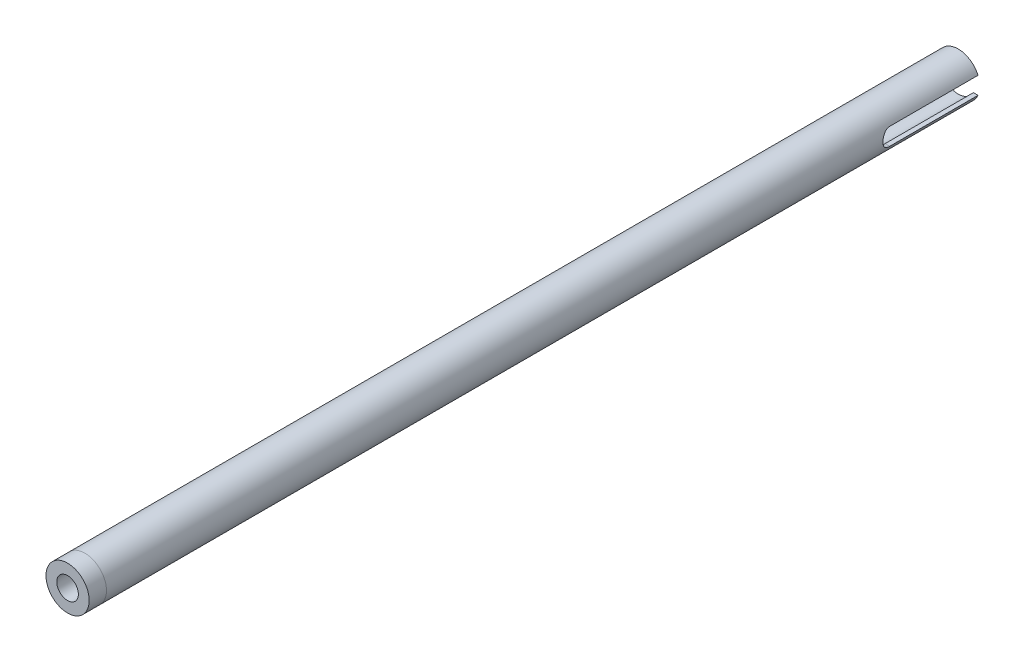
ISO-10303-21;
HEADER;
FILE_DESCRIPTION(('STEP AP214'),'2;1');
FILE_NAME('part.step','',(''),(''),'','','');
FILE_SCHEMA(('AUTOMOTIVE_DESIGN { 1 0 10303 214 1 1 1 1 }'));
ENDSEC;
DATA;
#1=APPLICATION_CONTEXT('core data for automotive mechanical design processes');
#2=APPLICATION_PROTOCOL_DEFINITION('international standard','automotive_design',2000,#1);
#3=PRODUCT_CONTEXT('',#1,'mechanical');
#4=PRODUCT('Part','Part','',(#3));
#5=PRODUCT_RELATED_PRODUCT_CATEGORY('part','',(#4));
#6=PRODUCT_DEFINITION_FORMATION('','',#4);
#7=PRODUCT_DEFINITION_CONTEXT('part definition',#1,'design');
#8=PRODUCT_DEFINITION('design','',#6,#7);
#9=PRODUCT_DEFINITION_SHAPE('','',#8);
#10=(LENGTH_UNIT() NAMED_UNIT(*) SI_UNIT(.MILLI.,.METRE.));
#11=(NAMED_UNIT(*) PLANE_ANGLE_UNIT() SI_UNIT($,.RADIAN.));
#12=(NAMED_UNIT(*) SI_UNIT($,.STERADIAN.) SOLID_ANGLE_UNIT());
#13=UNCERTAINTY_MEASURE_WITH_UNIT(LENGTH_MEASURE(1.E-05),#10,'distance_accuracy_value','');
#14=(GEOMETRIC_REPRESENTATION_CONTEXT(3) GLOBAL_UNCERTAINTY_ASSIGNED_CONTEXT((#13)) GLOBAL_UNIT_ASSIGNED_CONTEXT((#10,
#11,#12)) REPRESENTATION_CONTEXT('',''));
#15=CARTESIAN_POINT('',(0.,0.,0.));
#16=DIRECTION('',(0.,0.,1.));
#17=DIRECTION('',(1.,0.,0.));
#18=AXIS2_PLACEMENT_3D('',#15,#16,#17);
#19=CARTESIAN_POINT('',(0.,0.,-326.959127033778));
#20=DIRECTION('',(0.,0.,1.));
#21=DIRECTION('',(1.,0.,0.));
#22=AXIS2_PLACEMENT_3D('',#19,#20,#21);
#23=CYLINDRICAL_SURFACE('',#22,7.9375);
#24=CARTESIAN_POINT('',(0.,0.,-6.35));
#25=DIRECTION('',(0.,0.,1.));
#26=DIRECTION('',(1.,0.,0.));
#27=AXIS2_PLACEMENT_3D('',#24,#25,#26);
#28=CIRCLE('',#27,7.9375);
#29=CARTESIAN_POINT('',(7.9375,0.,-6.35));
#30=VERTEX_POINT('',#29);
#31=EDGE_CURVE('E175',#30,#30,#28,.T.);
#32=ORIENTED_EDGE('',*,*,#31,.F.);
#33=EDGE_LOOP('',(#32));
#34=FACE_BOUND('',#33,.T.);
#35=CARTESIAN_POINT('',(-7.2748389157424,3.175,-294.574127033778));
#36=CARTESIAN_POINT('',(-7.27482137043434,3.17501267173453,-294.488706918295));
#37=CARTESIAN_POINT('',(-7.27634297592672,3.17155313247793,-294.403296388732));
#38=CARTESIAN_POINT('',(-7.28233338484875,3.15778866907725,-294.233164384404));
#39=CARTESIAN_POINT('',(-7.28680106535325,3.14748635311323,-294.148442659545));
#40=CARTESIAN_POINT('',(-7.29852916312671,3.12019002880162,-293.980628959737));
#41=CARTESIAN_POINT('',(-7.30577831906487,3.10322299732751,-293.897531814977));
#42=CARTESIAN_POINT('',(-7.32282161153745,3.06278779397034,-293.733220712952));
#43=CARTESIAN_POINT('',(-7.33261590324725,3.03931922568674,-293.652006870839));
#44=CARTESIAN_POINT('',(-7.36535331460444,2.95952924342962,-293.412182048256));
#45=CARTESIAN_POINT('',(-7.39167595677839,2.89376893609239,-293.257057119452));
#46=CARTESIAN_POINT('',(-7.45033259991547,2.73920602658923,-292.959969692741));
#47=CARTESIAN_POINT('',(-7.48267254395243,2.65038060922872,-292.818020417523));
#48=CARTESIAN_POINT('',(-7.55175295441386,2.44684429809695,-292.543299648004));
#49=CARTESIAN_POINT('',(-7.58863404630154,2.33103943595689,-292.411372263492));
#50=CARTESIAN_POINT('',(-7.66147718953598,2.07914562663536,-292.16820937986));
#51=CARTESIAN_POINT('',(-7.69743902899202,1.94305205135848,-292.056978614932));
#52=CARTESIAN_POINT('',(-7.76611692840651,1.6477828266442,-291.854057415437));
#53=CARTESIAN_POINT('',(-7.79864638434712,1.48790317306357,-291.763323004033));
#54=CARTESIAN_POINT('',(-7.85502980346525,1.15369615984565,-291.610465450616));
#55=CARTESIAN_POINT('',(-7.87889360585224,0.979385463602728,-291.548309837998));
#56=CARTESIAN_POINT('',(-7.91022225039827,0.670405323433351,-291.467798194342));
#57=CARTESIAN_POINT('',(-7.92038443902171,0.537888188660434,-291.442120270933));
#58=CARTESIAN_POINT('',(-7.93061686811603,0.337231082382101,-291.416365187851));
#59=CARTESIAN_POINT('',(-7.93319257341971,0.269991647180293,-291.40990709057));
#60=CARTESIAN_POINT('',(-7.93663621925193,0.135173873369594,-291.401286072819));
#61=CARTESIAN_POINT('',(-7.93750363389236,0.0675954368175856,-291.399124475));
#62=CARTESIAN_POINT('',(-7.9375,0.,-291.399127033778));
#63=B_SPLINE_CURVE_WITH_KNOTS('',3,(#35,#36,#37,#38,#39,#40,#41,#42,#43,#44,#45,#46,#47,#48,#49,
#50,#51,#52,#53,#54,#55,#56,#57,#58,#59,#60,#61,#62),.UNSPECIFIED.,.F.,.F.,(4,2,2,2,2,2,2,2,2,2,
2,2,2,4),(0.,0.256160797396612,0.512224013007114,0.767261264672295,1.02231406945471,
1.53142416248594,2.04103978047897,2.57679273649398,3.11266809162683,3.6699113602974,
4.22651992730645,4.63134321412667,4.8339937586662,5.03670667834028),.UNSPECIFIED.);
#64=CARTESIAN_POINT('',(-7.2748389157424,3.175,-294.574127033778));
#65=VERTEX_POINT('',#64);
#66=CARTESIAN_POINT('',(-7.9375,0.,-291.399127033778));
#67=VERTEX_POINT('',#66);
#68=EDGE_CURVE('E209',#65,#67,#63,.T.);
#69=ORIENTED_EDGE('',*,*,#68,.T.);
#70=CARTESIAN_POINT('',(-7.9375,0.,-291.399127033778));
#71=CARTESIAN_POINT('',(-7.93751279435796,-0.0856973243893202,-291.399115003608));
#72=CARTESIAN_POINT('',(-7.93611246860092,-0.171386675169295,-291.402596371081));
#73=CARTESIAN_POINT('',(-7.93058107051394,-0.342092796869091,-291.416452466415));
#74=CARTESIAN_POINT('',(-7.92645080745519,-0.427109759557719,-291.426825151398));
#75=CARTESIAN_POINT('',(-7.91557399086504,-0.595570690948314,-291.454322345466));
#76=CARTESIAN_POINT('',(-7.90883664469869,-0.679019123580001,-291.471423096739));
#77=CARTESIAN_POINT('',(-7.89293284658536,-0.844038966454637,-291.512190344212));
#78=CARTESIAN_POINT('',(-7.88376629739099,-0.925610301410299,-291.535857103269));
#79=CARTESIAN_POINT('',(-7.8529700783248,-1.16656173687588,-291.616364758967));
#80=CARTESIAN_POINT('',(-7.82802544143957,-1.3224472028299,-291.682757391845));
#81=CARTESIAN_POINT('',(-7.77174407779742,-1.62081902572889,-291.838802795838));
#82=CARTESIAN_POINT('',(-7.74040257287306,-1.76329524966531,-291.928472967901));
#83=CARTESIAN_POINT('',(-7.67287736621953,-2.03755465224644,-292.132926575416));
#84=CARTESIAN_POINT('',(-7.63654472176442,-2.16862853615059,-292.248613432147));
#85=CARTESIAN_POINT('',(-7.56380976030912,-2.4101102261282,-292.499907533857));
#86=CARTESIAN_POINT('',(-7.52740741976911,-2.52050895891189,-292.635523478339));
#87=CARTESIAN_POINT('',(-7.45683282624283,-2.72240939900243,-292.930221973205));
#88=CARTESIAN_POINT('',(-7.4228346735038,-2.81283701743191,-293.090085963121));
#89=CARTESIAN_POINT('',(-7.36333622196319,-2.96511894168389,-293.424211927917));
#90=CARTESIAN_POINT('',(-7.33782422493328,-3.02701262758154,-293.598453665676));
#91=CARTESIAN_POINT('',(-7.30424985403508,-3.10695047193342,-293.906757390327));
#92=CARTESIAN_POINT('',(-7.29331360019113,-3.13238569878909,-294.038616151213));
#93=CARTESIAN_POINT('',(-7.28227977674291,-3.15790858319,-294.238333032907));
#94=CARTESIAN_POINT('',(-7.27949685702346,-3.16431127275806,-294.305281323667));
#95=CARTESIAN_POINT('',(-7.27577355567174,-3.17285909036155,-294.439522881533));
#96=CARTESIAN_POINT('',(-7.27483380475762,-3.1750027609968,-294.506816258831));
#97=CARTESIAN_POINT('',(-7.2748389157424,-3.175,-294.574127033778));
#98=B_SPLINE_CURVE_WITH_KNOTS('',3,(#70,#71,#72,#73,#74,#75,#76,#77,#78,#79,#80,#81,#82,#83,#84,
#85,#86,#87,#88,#89,#90,#91,#92,#93,#94,#95,#96,#97),.UNSPECIFIED.,.F.,.F.,(4,2,2,2,2,2,2,2,2,2,
2,2,2,4),(0.,0.256996432008012,0.513916713336978,0.769937797705373,1.02596913282157,
1.53722547809955,2.04886511530059,2.58219314099272,3.11575467201799,3.67332953074268,
4.2301325519037,4.63306130520176,4.8348500382744,5.03670780985613),.UNSPECIFIED.);
#99=CARTESIAN_POINT('',(-7.2748389157424,-3.175,-294.574127033778));
#100=VERTEX_POINT('',#99);
#101=EDGE_CURVE('E151',#67,#100,#98,.T.);
#102=ORIENTED_EDGE('',*,*,#101,.T.);
#103=DIRECTION('',(0.,0.,-1.));
#104=VECTOR('',#103,1.);
#105=CARTESIAN_POINT('',(-7.2748389157424,-3.175,-291.399127033778));
#106=LINE('',#105,#104);
#107=CARTESIAN_POINT('',(-7.2748389157424,-3.175,-326.959127033778));
#108=VERTEX_POINT('',#107);
#109=EDGE_CURVE('E146',#100,#108,#106,.T.);
#110=ORIENTED_EDGE('',*,*,#109,.T.);
#111=CARTESIAN_POINT('',(0.,0.,-326.959127033778));
#112=DIRECTION('',(0.,0.,1.));
#113=DIRECTION('',(1.,0.,0.));
#114=AXIS2_PLACEMENT_3D('',#111,#112,#113);
#115=CIRCLE('',#114,7.9375);
#116=CARTESIAN_POINT('',(7.2748389157424,-3.175,-326.959127033778));
#117=VERTEX_POINT('',#116);
#118=EDGE_CURVE('E149',#108,#117,#115,.T.);
#119=ORIENTED_EDGE('',*,*,#118,.T.);
#120=DIRECTION('',(0.,0.,-1.));
#121=VECTOR('',#120,1.);
#122=CARTESIAN_POINT('',(7.2748389157424,-3.175,-291.399127033778));
#123=LINE('',#122,#121);
#124=CARTESIAN_POINT('',(7.2748389157424,-3.175,-294.574127033778));
#125=VERTEX_POINT('',#124);
#126=EDGE_CURVE('E459',#125,#117,#123,.T.);
#127=ORIENTED_EDGE('',*,*,#126,.F.);
#128=CARTESIAN_POINT('',(7.2748389157424,-3.175,-294.574127033778));
#129=CARTESIAN_POINT('',(7.27482137043434,-3.17501267173453,-294.488706918295));
#130=CARTESIAN_POINT('',(7.27634297592672,-3.17155313247793,-294.403296388732));
#131=CARTESIAN_POINT('',(7.28233338484875,-3.15778866907725,-294.233164384404));
#132=CARTESIAN_POINT('',(7.28680106535325,-3.14748635311323,-294.148442659545));
#133=CARTESIAN_POINT('',(7.29852916312671,-3.12019002880162,-293.980628959737));
#134=CARTESIAN_POINT('',(7.30577831906487,-3.10322299732751,-293.897531814977));
#135=CARTESIAN_POINT('',(7.32282161153745,-3.06278779397034,-293.733220712952));
#136=CARTESIAN_POINT('',(7.33261590324725,-3.03931922568674,-293.652006870839));
#137=CARTESIAN_POINT('',(7.36535331460444,-2.95952924342962,-293.412182048256));
#138=CARTESIAN_POINT('',(7.39167595677839,-2.89376893609239,-293.257057119452));
#139=CARTESIAN_POINT('',(7.45033259991547,-2.73920602658923,-292.959969692741));
#140=CARTESIAN_POINT('',(7.48267254395243,-2.65038060922872,-292.818020417523));
#141=CARTESIAN_POINT('',(7.55175295441386,-2.44684429809695,-292.543299648004));
#142=CARTESIAN_POINT('',(7.58863404630154,-2.33103943595689,-292.411372263492));
#143=CARTESIAN_POINT('',(7.66147718953598,-2.07914562663536,-292.16820937986));
#144=CARTESIAN_POINT('',(7.69743902899202,-1.94305205135848,-292.056978614932));
#145=CARTESIAN_POINT('',(7.76611692840651,-1.6477828266442,-291.854057415437));
#146=CARTESIAN_POINT('',(7.79864638434712,-1.48790317306357,-291.763323004033));
#147=CARTESIAN_POINT('',(7.85502980346525,-1.15369615984565,-291.610465450616));
#148=CARTESIAN_POINT('',(7.87889360585224,-0.979385463602728,-291.548309837998));
#149=CARTESIAN_POINT('',(7.91022225039827,-0.670405323433351,-291.467798194342));
#150=CARTESIAN_POINT('',(7.92038443902171,-0.537888188660434,-291.442120270933));
#151=CARTESIAN_POINT('',(7.93061686811603,-0.337231082382101,-291.416365187851));
#152=CARTESIAN_POINT('',(7.93319257341971,-0.269991647180293,-291.40990709057));
#153=CARTESIAN_POINT('',(7.93663621925193,-0.135173873369594,-291.401286072819));
#154=CARTESIAN_POINT('',(7.93750363389236,-0.0675954368175856,-291.399124475));
#155=CARTESIAN_POINT('',(7.9375,0.,-291.399127033778));
#156=B_SPLINE_CURVE_WITH_KNOTS('',3,(#128,#129,#130,#131,#132,#133,#134,#135,#136,#137,#138,
#139,#140,#141,#142,#143,#144,#145,#146,#147,#148,#149,#150,#151,#152,#153,#154,#155),
.UNSPECIFIED.,.F.,.F.,(4,2,2,2,2,2,2,2,2,2,2,2,2,4),(0.,0.256160797396612,0.512224013007114,
0.767261264672295,1.02231406945471,1.53142416248594,2.04103978047897,2.57679273649398,
3.11266809162683,3.6699113602974,4.22651992730645,4.63134321412667,4.8339937586662,
5.03670667834028),.UNSPECIFIED.);
#157=CARTESIAN_POINT('',(7.9375,0.,-291.399127033778));
#158=VERTEX_POINT('',#157);
#159=EDGE_CURVE('E92',#125,#158,#156,.T.);
#160=ORIENTED_EDGE('',*,*,#159,.T.);
#161=CARTESIAN_POINT('',(7.9375,0.,-291.399127033778));
#162=CARTESIAN_POINT('',(7.93751279435796,0.0856973243893202,-291.399115003608));
#163=CARTESIAN_POINT('',(7.93611246860092,0.171386675169295,-291.402596371081));
#164=CARTESIAN_POINT('',(7.93058107051394,0.342092796869091,-291.416452466415));
#165=CARTESIAN_POINT('',(7.92645080745519,0.427109759557719,-291.426825151398));
#166=CARTESIAN_POINT('',(7.91557399086504,0.595570690948314,-291.454322345466));
#167=CARTESIAN_POINT('',(7.90883664469869,0.679019123580001,-291.471423096739));
#168=CARTESIAN_POINT('',(7.89293284658536,0.844038966454637,-291.512190344212));
#169=CARTESIAN_POINT('',(7.88376629739099,0.925610301410299,-291.535857103269));
#170=CARTESIAN_POINT('',(7.8529700783248,1.16656173687588,-291.616364758967));
#171=CARTESIAN_POINT('',(7.82802544143957,1.3224472028299,-291.682757391845));
#172=CARTESIAN_POINT('',(7.77174407779742,1.62081902572889,-291.838802795838));
#173=CARTESIAN_POINT('',(7.74040257287306,1.76329524966531,-291.928472967901));
#174=CARTESIAN_POINT('',(7.67287736621953,2.03755465224644,-292.132926575416));
#175=CARTESIAN_POINT('',(7.63654472176442,2.16862853615059,-292.248613432147));
#176=CARTESIAN_POINT('',(7.56380976030912,2.4101102261282,-292.499907533857));
#177=CARTESIAN_POINT('',(7.52740741976911,2.52050895891189,-292.635523478339));
#178=CARTESIAN_POINT('',(7.45683282624283,2.72240939900243,-292.930221973205));
#179=CARTESIAN_POINT('',(7.4228346735038,2.81283701743191,-293.090085963121));
#180=CARTESIAN_POINT('',(7.36333622196319,2.96511894168389,-293.424211927917));
#181=CARTESIAN_POINT('',(7.33782422493328,3.02701262758154,-293.598453665676));
#182=CARTESIAN_POINT('',(7.30424985403508,3.10695047193342,-293.906757390327));
#183=CARTESIAN_POINT('',(7.29331360019113,3.13238569878909,-294.038616151213));
#184=CARTESIAN_POINT('',(7.28227977674291,3.15790858319,-294.238333032907));
#185=CARTESIAN_POINT('',(7.27949685702346,3.16431127275806,-294.305281323667));
#186=CARTESIAN_POINT('',(7.27577355567174,3.17285909036155,-294.439522881533));
#187=CARTESIAN_POINT('',(7.27483380475762,3.1750027609968,-294.506816258831));
#188=CARTESIAN_POINT('',(7.2748389157424,3.175,-294.574127033778));
#189=B_SPLINE_CURVE_WITH_KNOTS('',3,(#161,#162,#163,#164,#165,#166,#167,#168,#169,#170,#171,
#172,#173,#174,#175,#176,#177,#178,#179,#180,#181,#182,#183,#184,#185,#186,#187,#188),
.UNSPECIFIED.,.F.,.F.,(4,2,2,2,2,2,2,2,2,2,2,2,2,4),(0.,0.256996432008012,0.513916713336978,
0.769937797705373,1.02596913282157,1.53722547809955,2.04886511530059,2.58219314099272,
3.11575467201799,3.67332953074268,4.2301325519037,4.63306130520176,4.8348500382744,
5.03670780985613),.UNSPECIFIED.);
#190=CARTESIAN_POINT('',(7.2748389157424,3.175,-294.574127033778));
#191=VERTEX_POINT('',#190);
#192=EDGE_CURVE('E78',#158,#191,#189,.T.);
#193=ORIENTED_EDGE('',*,*,#192,.T.);
#194=DIRECTION('',(0.,0.,-1.));
#195=VECTOR('',#194,1.);
#196=CARTESIAN_POINT('',(7.2748389157424,3.175,-291.399127033778));
#197=LINE('',#196,#195);
#198=CARTESIAN_POINT('',(7.2748389157424,3.175,-326.959127033778));
#199=VERTEX_POINT('',#198);
#200=EDGE_CURVE('E167',#191,#199,#197,.T.);
#201=ORIENTED_EDGE('',*,*,#200,.T.);
#202=CARTESIAN_POINT('',(-7.2748389157424,3.175,-326.959127033778));
#203=VERTEX_POINT('',#202);
#204=EDGE_CURVE('E174',#199,#203,#115,.T.);
#205=ORIENTED_EDGE('',*,*,#204,.T.);
#206=DIRECTION('',(0.,0.,-1.));
#207=VECTOR('',#206,1.);
#208=CARTESIAN_POINT('',(-7.2748389157424,3.175,-291.399127033778));
#209=LINE('',#208,#207);
#210=EDGE_CURVE('E448',#65,#203,#209,.T.);
#211=ORIENTED_EDGE('',*,*,#210,.F.);
#212=EDGE_LOOP('',(#69,#102,#110,#119,#127,#160,#193,#201,#205,#211));
#213=FACE_BOUND('',#212,.T.);
#214=ADVANCED_FACE('F67',(#34,#213),#23,.T.);
#215=CARTESIAN_POINT('',(0.,0.,-326.959127033778));
#216=DIRECTION('',(0.,0.,1.));
#217=DIRECTION('',(1.,0.,0.));
#218=AXIS2_PLACEMENT_3D('',#215,#216,#217);
#219=PLANE('',#218);
#220=DIRECTION('',(1.,0.,0.));
#221=VECTOR('',#220,1.);
#222=CARTESIAN_POINT('',(0.,-3.175,-326.959127033778));
#223=LINE('',#222,#221);
#224=CARTESIAN_POINT('',(-5.57246419907746,-3.175,-326.959127033778));
#225=VERTEX_POINT('',#224);
#226=EDGE_CURVE('E159',#108,#225,#223,.T.);
#227=ORIENTED_EDGE('',*,*,#226,.T.);
#228=CARTESIAN_POINT('',(0.,0.,-326.959127033778));
#229=DIRECTION('',(0.,0.,1.));
#230=DIRECTION('',(1.,0.,0.));
#231=AXIS2_PLACEMENT_3D('',#228,#229,#230);
#232=CIRCLE('',#231,6.4135);
#233=CARTESIAN_POINT('',(5.57246419907746,-3.175,-326.959127033778));
#234=VERTEX_POINT('',#233);
#235=EDGE_CURVE('E300',#225,#234,#232,.T.);
#236=ORIENTED_EDGE('',*,*,#235,.T.);
#237=DIRECTION('',(1.,0.,0.));
#238=VECTOR('',#237,1.);
#239=CARTESIAN_POINT('',(0.,-3.175,-326.959127033778));
#240=LINE('',#239,#238);
#241=EDGE_CURVE('E172',#234,#117,#240,.T.);
#242=ORIENTED_EDGE('',*,*,#241,.T.);
#243=ORIENTED_EDGE('',*,*,#118,.F.);
#244=EDGE_LOOP('',(#227,#236,#242,#243));
#245=FACE_BOUND('',#244,.T.);
#246=ADVANCED_FACE('F170',(#245),#219,.F.);
#247=CARTESIAN_POINT('',(0.,0.,-326.959127033778));
#248=DIRECTION('',(0.,0.,1.));
#249=DIRECTION('',(1.,0.,0.));
#250=AXIS2_PLACEMENT_3D('',#247,#248,#249);
#251=CYLINDRICAL_SURFACE('',#250,6.4135);
#252=CARTESIAN_POINT('',(0.,0.,-6.35));
#253=DIRECTION('',(0.,0.,1.));
#254=DIRECTION('',(1.,0.,0.));
#255=AXIS2_PLACEMENT_3D('',#252,#253,#254);
#256=CIRCLE('',#255,6.4135);
#257=CARTESIAN_POINT('',(6.4135,0.,-6.35));
#258=VERTEX_POINT('',#257);
#259=EDGE_CURVE('E155',#258,#258,#256,.T.);
#260=ORIENTED_EDGE('',*,*,#259,.T.);
#261=EDGE_LOOP('',(#260));
#262=FACE_BOUND('',#261,.T.);
#263=DIRECTION('',(0.,0.,-1.));
#264=VECTOR('',#263,1.);
#265=CARTESIAN_POINT('',(-5.57246419907746,-3.175,-291.399127033778));
#266=LINE('',#265,#264);
#267=CARTESIAN_POINT('',(-5.57246419907746,-3.175,-294.574127033778));
#268=VERTEX_POINT('',#267);
#269=EDGE_CURVE('E156',#268,#225,#266,.T.);
#270=ORIENTED_EDGE('',*,*,#269,.F.);
#271=CARTESIAN_POINT('',(-5.57246419907746,-3.175,-294.574127033778));
#272=CARTESIAN_POINT('',(-5.57244013006406,-3.17501485930532,-294.490847920739));
#273=CARTESIAN_POINT('',(-5.57433046393327,-3.17172393593588,-294.407582153869));
#274=CARTESIAN_POINT('',(-5.58175879139227,-3.1586474174694,-294.241774569057));
#275=CARTESIAN_POINT('',(-5.58729459414878,-3.14886572313218,-294.159232346456));
#276=CARTESIAN_POINT('',(-5.60179156831921,-3.12299843383606,-293.995935539726));
#277=CARTESIAN_POINT('',(-5.61073298145,-3.10694918790096,-293.915173434813));
#278=CARTESIAN_POINT('',(-5.63171276239417,-3.06875665913499,-293.755529519312));
#279=CARTESIAN_POINT('',(-5.64375147558632,-3.04661269666535,-293.676647919492));
#280=CARTESIAN_POINT('',(-5.6838799338154,-2.97148657354665,-293.443914744493));
#281=CARTESIAN_POINT('',(-5.71602843451585,-2.9097324304215,-293.293494247254));
#282=CARTESIAN_POINT('',(-5.78746445334562,-2.76491119647659,-293.005037030426));
#283=CARTESIAN_POINT('',(-5.82676307252431,-2.68181088046088,-292.86702007306));
#284=CARTESIAN_POINT('',(-5.91189137020974,-2.48887418737119,-292.595222989032));
#285=CARTESIAN_POINT('',(-5.95799203211626,-2.37743022169017,-292.462666186581));
#286=CARTESIAN_POINT('',(-6.04933625068998,-2.1343317962695,-292.217198517508));
#287=CARTESIAN_POINT('',(-6.09457954365871,-2.00267122837298,-292.104293610495));
#288=CARTESIAN_POINT('',(-6.18270630442022,-1.71220053093684,-291.893974318043));
#289=CARTESIAN_POINT('',(-6.22523407848511,-1.55216870534977,-291.798084567612));
#290=CARTESIAN_POINT('',(-6.29953728626817,-1.21586879246633,-291.635235671295));
#291=CARTESIAN_POINT('',(-6.33132906884324,-1.03962591706377,-291.568232493252));
#292=CARTESIAN_POINT('',(-6.37455801221378,-0.719418942476251,-291.478360660921));
#293=CARTESIAN_POINT('',(-6.38903678436651,-0.577736145507957,-291.448787946557));
#294=CARTESIAN_POINT('',(-6.40364692368403,-0.362616983152035,-291.419066872242));
#295=CARTESIAN_POINT('',(-6.40733246196224,-0.290370591494077,-291.411599359605));
#296=CARTESIAN_POINT('',(-6.41226237468065,-0.145424356491906,-291.401626470667));
#297=CARTESIAN_POINT('',(-6.41350576158006,-0.072724341630371,-291.399123101729));
#298=CARTESIAN_POINT('',(-6.4135,0.,-291.399127033778));
#299=B_SPLINE_CURVE_WITH_KNOTS('',3,(#271,#272,#273,#274,#275,#276,#277,#278,#279,#280,#281,
#282,#283,#284,#285,#286,#287,#288,#289,#290,#291,#292,#293,#294,#295,#296,#297,#298),
.UNSPECIFIED.,.F.,.F.,(4,2,2,2,2,2,2,2,2,2,2,2,2,4),(0.,0.249729002226553,0.499308060527526,
0.747460667546715,0.995640957972498,1.49055300136661,1.98624009021394,2.52160227908796,
3.05712653941521,3.62817923327589,4.19835836008502,4.63305000595099,4.85103401853339,
5.06910615989469),.UNSPECIFIED.);
#300=CARTESIAN_POINT('',(-6.4135,0.,-291.399127033778));
#301=VERTEX_POINT('',#300);
#302=EDGE_CURVE('E236',#268,#301,#299,.T.);
#303=ORIENTED_EDGE('',*,*,#302,.T.);
#304=CARTESIAN_POINT('',(-6.4135,0.,-291.399127033778));
#305=CARTESIAN_POINT('',(-6.41351478956106,0.0839162873638173,-291.399113633881));
#306=CARTESIAN_POINT('',(-6.41185341043851,0.167823114288178,-291.402453559929));
#307=CARTESIAN_POINT('',(-6.40528923860734,0.334952536326365,-291.415736000533));
#308=CARTESIAN_POINT('',(-6.40038773102953,0.41817538948009,-291.425675897354));
#309=CARTESIAN_POINT('',(-6.38748331817869,0.582965498785221,-291.451994701872));
#310=CARTESIAN_POINT('',(-6.37949454331383,0.664538541389254,-291.46834427736));
#311=CARTESIAN_POINT('',(-6.36062930478242,0.82582159525237,-291.507282580954));
#312=CARTESIAN_POINT('',(-6.34975266552956,0.905531492908813,-291.529871688435));
#313=CARTESIAN_POINT('',(-6.31319792977547,1.14087800407252,-291.606608251194));
#314=CARTESIAN_POINT('',(-6.28356695572383,1.29306927815055,-291.669779899383));
#315=CARTESIAN_POINT('',(-6.21648032622801,1.58455945770354,-291.817930641362));
#316=CARTESIAN_POINT('',(-6.17901685649498,1.72384528592309,-291.902931533142));
#317=CARTESIAN_POINT('',(-6.09713913910647,1.99475482128857,-292.098031671393));
#318=CARTESIAN_POINT('',(-6.05244508581476,2.12544046453043,-292.209316548132));
#319=CARTESIAN_POINT('',(-5.96206469267669,2.36716277188881,-292.451285994297));
#320=CARTESIAN_POINT('',(-5.9163776032387,2.47818397002904,-292.581985686136));
#321=CARTESIAN_POINT('',(-5.82517699615972,2.68591268931947,-292.871031515088));
#322=CARTESIAN_POINT('',(-5.77994318763785,2.78087960507693,-293.030726709669));
#323=CARTESIAN_POINT('',(-5.69959190124919,2.94207442790849,-293.36610998685));
#324=CARTESIAN_POINT('',(-5.66445328320705,3.00836254036259,-293.541763620022));
#325=CARTESIAN_POINT('',(-5.61637168534322,3.09697219420916,-293.860214994416));
#326=CARTESIAN_POINT('',(-5.60011055849822,3.12606223436071,-294.000629597075));
#327=CARTESIAN_POINT('',(-5.58363385282995,3.15533369889113,-294.214006475318));
#328=CARTESIAN_POINT('',(-5.57946041232981,3.16269716900746,-294.2857382002));
#329=CARTESIAN_POINT('',(-5.57386984218861,3.17253394278506,-294.429680140242));
#330=CARTESIAN_POINT('',(-5.57245416126573,3.17500467618403,-294.501890586914));
#331=CARTESIAN_POINT('',(-5.57246419907746,3.175,-294.574127033778));
#332=B_SPLINE_CURVE_WITH_KNOTS('',3,(#304,#305,#306,#307,#308,#309,#310,#311,#312,#313,#314,
#315,#316,#317,#318,#319,#320,#321,#322,#323,#324,#325,#326,#327,#328,#329,#330,#331),
.UNSPECIFIED.,.F.,.F.,(4,2,2,2,2,2,2,2,2,2,2,2,2,4),(0.,0.251650249697321,0.503200747298848,
0.753613280993143,1.00404104361821,1.50387930503277,2.00421864304452,2.53410176460236,
3.06439980342595,3.63519589642623,4.20478783377489,4.63602373673199,4.85251353275909,
5.06911702550462),.UNSPECIFIED.);
#333=CARTESIAN_POINT('',(-5.57246419907746,3.175,-294.574127033778));
#334=VERTEX_POINT('',#333);
#335=EDGE_CURVE('E200',#301,#334,#332,.T.);
#336=ORIENTED_EDGE('',*,*,#335,.T.);
#337=DIRECTION('',(0.,0.,-1.));
#338=VECTOR('',#337,1.);
#339=CARTESIAN_POINT('',(-5.57246419907746,3.175,-291.399127033778));
#340=LINE('',#339,#338);
#341=CARTESIAN_POINT('',(-5.57246419907746,3.175,-326.959127033778));
#342=VERTEX_POINT('',#341);
#343=EDGE_CURVE('E444',#334,#342,#340,.T.);
#344=ORIENTED_EDGE('',*,*,#343,.T.);
#345=CARTESIAN_POINT('',(5.57246419907746,3.175,-326.959127033778));
#346=VERTEX_POINT('',#345);
#347=EDGE_CURVE('E182',#346,#342,#232,.T.);
#348=ORIENTED_EDGE('',*,*,#347,.F.);
#349=DIRECTION('',(0.,0.,-1.));
#350=VECTOR('',#349,1.);
#351=CARTESIAN_POINT('',(5.57246419907746,3.175,-291.399127033778));
#352=LINE('',#351,#350);
#353=CARTESIAN_POINT('',(5.57246419907746,3.175,-294.574127033778));
#354=VERTEX_POINT('',#353);
#355=EDGE_CURVE('E292',#354,#346,#352,.T.);
#356=ORIENTED_EDGE('',*,*,#355,.F.);
#357=CARTESIAN_POINT('',(5.57246419907746,3.175,-294.574127033778));
#358=CARTESIAN_POINT('',(5.57244013006406,3.17501485930532,-294.490847920739));
#359=CARTESIAN_POINT('',(5.57433046393327,3.17172393593588,-294.407582153869));
#360=CARTESIAN_POINT('',(5.58175879139227,3.1586474174694,-294.241774569057));
#361=CARTESIAN_POINT('',(5.58729459414878,3.14886572313218,-294.159232346456));
#362=CARTESIAN_POINT('',(5.60179156831921,3.12299843383606,-293.995935539726));
#363=CARTESIAN_POINT('',(5.61073298145,3.10694918790096,-293.915173434813));
#364=CARTESIAN_POINT('',(5.63171276239417,3.06875665913499,-293.755529519312));
#365=CARTESIAN_POINT('',(5.64375147558632,3.04661269666535,-293.676647919492));
#366=CARTESIAN_POINT('',(5.6838799338154,2.97148657354665,-293.443914744493));
#367=CARTESIAN_POINT('',(5.71602843451585,2.9097324304215,-293.293494247254));
#368=CARTESIAN_POINT('',(5.78746445334562,2.76491119647659,-293.005037030426));
#369=CARTESIAN_POINT('',(5.82676307252431,2.68181088046088,-292.86702007306));
#370=CARTESIAN_POINT('',(5.91189137020974,2.48887418737119,-292.595222989032));
#371=CARTESIAN_POINT('',(5.95799203211626,2.37743022169017,-292.462666186581));
#372=CARTESIAN_POINT('',(6.04933625068998,2.1343317962695,-292.217198517508));
#373=CARTESIAN_POINT('',(6.09457954365871,2.00267122837298,-292.104293610495));
#374=CARTESIAN_POINT('',(6.18270630442022,1.71220053093684,-291.893974318043));
#375=CARTESIAN_POINT('',(6.22523407848511,1.55216870534977,-291.798084567612));
#376=CARTESIAN_POINT('',(6.29953728626817,1.21586879246633,-291.635235671295));
#377=CARTESIAN_POINT('',(6.33132906884324,1.03962591706377,-291.568232493252));
#378=CARTESIAN_POINT('',(6.37455801221378,0.719418942476251,-291.478360660921));
#379=CARTESIAN_POINT('',(6.38903678436651,0.577736145507957,-291.448787946557));
#380=CARTESIAN_POINT('',(6.40364692368403,0.362616983152035,-291.419066872242));
#381=CARTESIAN_POINT('',(6.40733246196224,0.290370591494077,-291.411599359605));
#382=CARTESIAN_POINT('',(6.41226237468065,0.145424356491906,-291.401626470667));
#383=CARTESIAN_POINT('',(6.41350576158006,0.072724341630371,-291.399123101729));
#384=CARTESIAN_POINT('',(6.4135,0.,-291.399127033778));
#385=B_SPLINE_CURVE_WITH_KNOTS('',3,(#357,#358,#359,#360,#361,#362,#363,#364,#365,#366,#367,
#368,#369,#370,#371,#372,#373,#374,#375,#376,#377,#378,#379,#380,#381,#382,#383,#384),
.UNSPECIFIED.,.F.,.F.,(4,2,2,2,2,2,2,2,2,2,2,2,2,4),(0.,0.249729002226553,0.499308060527526,
0.747460667546715,0.995640957972498,1.49055300136661,1.98624009021394,2.52160227908796,
3.05712653941521,3.62817923327589,4.19835836008502,4.63305000595099,4.85103401853339,
5.06910615989469),.UNSPECIFIED.);
#386=CARTESIAN_POINT('',(6.4135,0.,-291.399127033778));
#387=VERTEX_POINT('',#386);
#388=EDGE_CURVE('E13',#354,#387,#385,.T.);
#389=ORIENTED_EDGE('',*,*,#388,.T.);
#390=CARTESIAN_POINT('',(6.4135,0.,-291.399127033778));
#391=CARTESIAN_POINT('',(6.41351478956106,-0.0839162873638173,-291.399113633881));
#392=CARTESIAN_POINT('',(6.41185341043851,-0.167823114288178,-291.402453559929));
#393=CARTESIAN_POINT('',(6.40528923860734,-0.334952536326365,-291.415736000533));
#394=CARTESIAN_POINT('',(6.40038773102953,-0.41817538948009,-291.425675897354));
#395=CARTESIAN_POINT('',(6.38748331817869,-0.582965498785221,-291.451994701872));
#396=CARTESIAN_POINT('',(6.37949454331383,-0.664538541389254,-291.46834427736));
#397=CARTESIAN_POINT('',(6.36062930478242,-0.82582159525237,-291.507282580954));
#398=CARTESIAN_POINT('',(6.34975266552956,-0.905531492908813,-291.529871688435));
#399=CARTESIAN_POINT('',(6.31319792977547,-1.14087800407252,-291.606608251194));
#400=CARTESIAN_POINT('',(6.28356695572383,-1.29306927815055,-291.669779899383));
#401=CARTESIAN_POINT('',(6.21648032622801,-1.58455945770354,-291.817930641362));
#402=CARTESIAN_POINT('',(6.17901685649498,-1.72384528592309,-291.902931533142));
#403=CARTESIAN_POINT('',(6.09713913910647,-1.99475482128857,-292.098031671393));
#404=CARTESIAN_POINT('',(6.05244508581476,-2.12544046453043,-292.209316548132));
#405=CARTESIAN_POINT('',(5.96206469267669,-2.36716277188881,-292.451285994297));
#406=CARTESIAN_POINT('',(5.9163776032387,-2.47818397002904,-292.581985686136));
#407=CARTESIAN_POINT('',(5.82517699615972,-2.68591268931947,-292.871031515088));
#408=CARTESIAN_POINT('',(5.77994318763785,-2.78087960507693,-293.030726709669));
#409=CARTESIAN_POINT('',(5.69959190124919,-2.94207442790849,-293.36610998685));
#410=CARTESIAN_POINT('',(5.66445328320705,-3.00836254036259,-293.541763620022));
#411=CARTESIAN_POINT('',(5.61637168534322,-3.09697219420916,-293.860214994416));
#412=CARTESIAN_POINT('',(5.60011055849822,-3.12606223436071,-294.000629597075));
#413=CARTESIAN_POINT('',(5.58363385282995,-3.15533369889113,-294.214006475318));
#414=CARTESIAN_POINT('',(5.57946041232981,-3.16269716900746,-294.2857382002));
#415=CARTESIAN_POINT('',(5.57386984218861,-3.17253394278506,-294.429680140242));
#416=CARTESIAN_POINT('',(5.57245416126573,-3.17500467618403,-294.501890586914));
#417=CARTESIAN_POINT('',(5.57246419907746,-3.175,-294.574127033778));
#418=B_SPLINE_CURVE_WITH_KNOTS('',3,(#390,#391,#392,#393,#394,#395,#396,#397,#398,#399,#400,
#401,#402,#403,#404,#405,#406,#407,#408,#409,#410,#411,#412,#413,#414,#415,#416,#417),
.UNSPECIFIED.,.F.,.F.,(4,2,2,2,2,2,2,2,2,2,2,2,2,4),(0.,0.251650249697321,0.503200747298848,
0.753613280993143,1.00404104361821,1.50387930503277,2.00421864304452,2.53410176460236,
3.06439980342595,3.63519589642623,4.20478783377489,4.63602373673199,4.85251353275909,
5.06911702550462),.UNSPECIFIED.);
#419=CARTESIAN_POINT('',(5.57246419907746,-3.175,-294.574127033778));
#420=VERTEX_POINT('',#419);
#421=EDGE_CURVE('E254',#387,#420,#418,.T.);
#422=ORIENTED_EDGE('',*,*,#421,.T.);
#423=DIRECTION('',(0.,0.,-1.));
#424=VECTOR('',#423,1.);
#425=CARTESIAN_POINT('',(5.57246419907746,-3.175,-291.399127033778));
#426=LINE('',#425,#424);
#427=EDGE_CURVE('E295',#420,#234,#426,.T.);
#428=ORIENTED_EDGE('',*,*,#427,.T.);
#429=ORIENTED_EDGE('',*,*,#235,.F.);
#430=EDGE_LOOP('',(#270,#303,#336,#344,#348,#356,#389,#422,#428,#429));
#431=FACE_BOUND('',#430,.T.);
#432=ADVANCED_FACE('F216',(#262,#431),#251,.F.);
#433=ORIENTED_EDGE('',*,*,#347,.T.);
#434=DIRECTION('',(1.,0.,0.));
#435=VECTOR('',#434,1.);
#436=CARTESIAN_POINT('',(0.,3.175,-326.959127033778));
#437=LINE('',#436,#435);
#438=EDGE_CURVE('E166',#203,#342,#437,.T.);
#439=ORIENTED_EDGE('',*,*,#438,.F.);
#440=ORIENTED_EDGE('',*,*,#204,.F.);
#441=DIRECTION('',(1.,0.,0.));
#442=VECTOR('',#441,1.);
#443=CARTESIAN_POINT('',(0.,3.175,-326.959127033778));
#444=LINE('',#443,#442);
#445=EDGE_CURVE('E273',#346,#199,#444,.T.);
#446=ORIENTED_EDGE('',*,*,#445,.F.);
#447=EDGE_LOOP('',(#433,#439,#440,#446));
#448=FACE_BOUND('',#447,.T.);
#449=ADVANCED_FACE('F313',(#448),#219,.F.);
#450=CARTESIAN_POINT('',(0.,0.,-6.35));
#451=DIRECTION('',(0.,0.,1.));
#452=DIRECTION('',(1.,0.,0.));
#453=AXIS2_PLACEMENT_3D('',#450,#451,#452);
#454=PLANE('',#453);
#455=ORIENTED_EDGE('',*,*,#259,.F.);
#456=EDGE_LOOP('',(#455));
#457=FACE_BOUND('',#456,.T.);
#458=ORIENTED_EDGE('',*,*,#31,.T.);
#459=EDGE_LOOP('',(#458));
#460=FACE_BOUND('',#459,.T.);
#461=ADVANCED_FACE('F310',(#457,#460),#454,.T.);
#462=CARTESIAN_POINT('',(0.,3.175,-291.399127033778));
#463=DIRECTION('',(0.,1.,0.));
#464=DIRECTION('',(0.,0.,1.));
#465=AXIS2_PLACEMENT_3D('',#462,#463,#464);
#466=PLANE('',#465);
#467=ORIENTED_EDGE('',*,*,#200,.F.);
#468=DIRECTION('',(1.,0.,0.));
#469=VECTOR('',#468,1.);
#470=CARTESIAN_POINT('',(5.57246419907746,3.175,-294.574127033778));
#471=LINE('',#470,#469);
#472=EDGE_CURVE('E197',#191,#354,#471,.F.);
#473=ORIENTED_EDGE('',*,*,#472,.T.);
#474=ORIENTED_EDGE('',*,*,#355,.T.);
#475=ORIENTED_EDGE('',*,*,#445,.T.);
#476=EDGE_LOOP('',(#467,#473,#474,#475));
#477=FACE_BOUND('',#476,.T.);
#478=ADVANCED_FACE('F288',(#477),#466,.F.);
#479=CARTESIAN_POINT('',(0.,-3.175,-291.399127033778));
#480=DIRECTION('',(0.,1.,0.));
#481=DIRECTION('',(0.,0.,1.));
#482=AXIS2_PLACEMENT_3D('',#479,#480,#481);
#483=PLANE('',#482);
#484=ORIENTED_EDGE('',*,*,#427,.F.);
#485=DIRECTION('',(1.,0.,0.));
#486=VECTOR('',#485,1.);
#487=CARTESIAN_POINT('',(0.,-3.175,-294.574127033778));
#488=LINE('',#487,#486);
#489=EDGE_CURVE('E193',#420,#125,#488,.T.);
#490=ORIENTED_EDGE('',*,*,#489,.T.);
#491=ORIENTED_EDGE('',*,*,#126,.T.);
#492=ORIENTED_EDGE('',*,*,#241,.F.);
#493=EDGE_LOOP('',(#484,#490,#491,#492));
#494=FACE_BOUND('',#493,.T.);
#495=ADVANCED_FACE('F388',(#494),#483,.T.);
#496=CARTESIAN_POINT('',(0.,-3.175,-291.399127033778));
#497=DIRECTION('',(0.,1.,0.));
#498=DIRECTION('',(0.,0.,1.));
#499=AXIS2_PLACEMENT_3D('',#496,#497,#498);
#500=PLANE('',#499);
#501=ORIENTED_EDGE('',*,*,#109,.F.);
#502=DIRECTION('',(1.,0.,0.));
#503=VECTOR('',#502,1.);
#504=CARTESIAN_POINT('',(0.,-3.175,-294.574127033778));
#505=LINE('',#504,#503);
#506=EDGE_CURVE('E190',#100,#268,#505,.T.);
#507=ORIENTED_EDGE('',*,*,#506,.T.);
#508=ORIENTED_EDGE('',*,*,#269,.T.);
#509=ORIENTED_EDGE('',*,*,#226,.F.);
#510=EDGE_LOOP('',(#501,#507,#508,#509));
#511=FACE_BOUND('',#510,.T.);
#512=ADVANCED_FACE('F160',(#511),#500,.T.);
#513=CARTESIAN_POINT('',(0.,3.175,-291.399127033778));
#514=DIRECTION('',(0.,1.,0.));
#515=DIRECTION('',(0.,0.,1.));
#516=AXIS2_PLACEMENT_3D('',#513,#514,#515);
#517=PLANE('',#516);
#518=ORIENTED_EDGE('',*,*,#343,.F.);
#519=DIRECTION('',(1.,0.,0.));
#520=VECTOR('',#519,1.);
#521=CARTESIAN_POINT('',(-7.2748389157424,3.175,-294.574127033778));
#522=LINE('',#521,#520);
#523=EDGE_CURVE('E180',#334,#65,#522,.F.);
#524=ORIENTED_EDGE('',*,*,#523,.T.);
#525=ORIENTED_EDGE('',*,*,#210,.T.);
#526=ORIENTED_EDGE('',*,*,#438,.T.);
#527=EDGE_LOOP('',(#518,#524,#525,#526));
#528=FACE_BOUND('',#527,.T.);
#529=ADVANCED_FACE('F231',(#528),#517,.F.);
#530=CARTESIAN_POINT('',(0.,0.,-294.574127033778));
#531=DIRECTION('',(1.,0.,0.));
#532=DIRECTION('',(0.,0.,-1.));
#533=AXIS2_PLACEMENT_3D('',#530,#531,#532);
#534=CYLINDRICAL_SURFACE('',#533,3.175);
#535=ORIENTED_EDGE('',*,*,#506,.F.);
#536=ORIENTED_EDGE('',*,*,#101,.F.);
#537=DIRECTION('',(1.,0.,0.));
#538=VECTOR('',#537,1.);
#539=CARTESIAN_POINT('',(0.,0.,-291.399127033778));
#540=LINE('',#539,#538);
#541=EDGE_CURVE('E270',#301,#67,#540,.F.);
#542=ORIENTED_EDGE('',*,*,#541,.F.);
#543=ORIENTED_EDGE('',*,*,#302,.F.);
#544=EDGE_LOOP('',(#535,#536,#542,#543));
#545=FACE_BOUND('',#544,.T.);
#546=ADVANCED_FACE('F224',(#545),#534,.F.);
#547=CARTESIAN_POINT('',(0.,0.,-294.574127033778));
#548=DIRECTION('',(-1.,0.,0.));
#549=DIRECTION('',(0.,0.,1.));
#550=AXIS2_PLACEMENT_3D('',#547,#548,#549);
#551=CYLINDRICAL_SURFACE('',#550,3.175);
#552=ORIENTED_EDGE('',*,*,#68,.F.);
#553=ORIENTED_EDGE('',*,*,#523,.F.);
#554=ORIENTED_EDGE('',*,*,#335,.F.);
#555=ORIENTED_EDGE('',*,*,#541,.T.);
#556=EDGE_LOOP('',(#552,#553,#554,#555));
#557=FACE_BOUND('',#556,.T.);
#558=ADVANCED_FACE('F220',(#557),#551,.F.);
#559=CARTESIAN_POINT('',(0.,0.,-294.574127033778));
#560=DIRECTION('',(-1.,0.,0.));
#561=DIRECTION('',(0.,0.,1.));
#562=AXIS2_PLACEMENT_3D('',#559,#560,#561);
#563=CYLINDRICAL_SURFACE('',#562,3.175);
#564=DIRECTION('',(1.,0.,0.));
#565=VECTOR('',#564,1.);
#566=CARTESIAN_POINT('',(7.2748389157424,0.,-291.399127033778));
#567=LINE('',#566,#565);
#568=EDGE_CURVE('E72',#387,#158,#567,.T.);
#569=ORIENTED_EDGE('',*,*,#568,.F.);
#570=ORIENTED_EDGE('',*,*,#388,.F.);
#571=ORIENTED_EDGE('',*,*,#472,.F.);
#572=ORIENTED_EDGE('',*,*,#192,.F.);
#573=EDGE_LOOP('',(#569,#570,#571,#572));
#574=FACE_BOUND('',#573,.T.);
#575=ADVANCED_FACE('F69',(#574),#563,.F.);
#576=CARTESIAN_POINT('',(0.,0.,-294.574127033778));
#577=DIRECTION('',(1.,0.,0.));
#578=DIRECTION('',(0.,0.,-1.));
#579=AXIS2_PLACEMENT_3D('',#576,#577,#578);
#580=CYLINDRICAL_SURFACE('',#579,3.175);
#581=ORIENTED_EDGE('',*,*,#421,.F.);
#582=ORIENTED_EDGE('',*,*,#568,.T.);
#583=ORIENTED_EDGE('',*,*,#159,.F.);
#584=ORIENTED_EDGE('',*,*,#489,.F.);
#585=EDGE_LOOP('',(#581,#582,#583,#584));
#586=FACE_BOUND('',#585,.T.);
#587=ADVANCED_FACE('F233',(#586),#580,.F.);
#588=CLOSED_SHELL('',(#214,#246,#432,#449,#461,#478,#495,#512,#529,#546,#558,#575,#587));
#589=MANIFOLD_SOLID_BREP('B2',#588);
#590=CARTESIAN_POINT('',(0.,0.,-6.35));
#591=DIRECTION('',(0.,0.,1.));
#592=DIRECTION('',(1.,0.,0.));
#593=AXIS2_PLACEMENT_3D('',#590,#591,#592);
#594=CYLINDRICAL_SURFACE('',#593,7.9375);
#595=CARTESIAN_POINT('',(0.,0.,-6.35));
#596=DIRECTION('',(0.,0.,1.));
#597=DIRECTION('',(1.,0.,0.));
#598=AXIS2_PLACEMENT_3D('',#595,#596,#597);
#599=CIRCLE('',#598,7.9375);
#600=CARTESIAN_POINT('',(7.9375,0.,-6.35));
#601=VERTEX_POINT('',#600);
#602=EDGE_CURVE('E66',#601,#601,#599,.T.);
#603=ORIENTED_EDGE('',*,*,#602,.T.);
#604=EDGE_LOOP('',(#603));
#605=FACE_BOUND('',#604,.T.);
#606=CARTESIAN_POINT('',(0.,0.,0.));
#607=DIRECTION('',(0.,0.,1.));
#608=DIRECTION('',(1.,0.,0.));
#609=AXIS2_PLACEMENT_3D('',#606,#607,#608);
#610=CIRCLE('',#609,7.9375);
#611=CARTESIAN_POINT('',(7.9375,0.,0.));
#612=VERTEX_POINT('',#611);
#613=EDGE_CURVE('E501',#612,#612,#610,.T.);
#614=ORIENTED_EDGE('',*,*,#613,.F.);
#615=EDGE_LOOP('',(#614));
#616=FACE_BOUND('',#615,.T.);
#617=ADVANCED_FACE('F490',(#605,#616),#594,.T.);
#618=CARTESIAN_POINT('',(0.,0.,-6.35));
#619=DIRECTION('',(0.,0.,1.));
#620=DIRECTION('',(1.,0.,0.));
#621=AXIS2_PLACEMENT_3D('',#618,#619,#620);
#622=CYLINDRICAL_SURFACE('',#621,3.96875);
#623=CARTESIAN_POINT('',(0.,0.,0.));
#624=DIRECTION('',(0.,0.,1.));
#625=DIRECTION('',(1.,0.,0.));
#626=AXIS2_PLACEMENT_3D('',#623,#624,#625);
#627=CIRCLE('',#626,3.96875);
#628=CARTESIAN_POINT('',(3.96875,0.,0.));
#629=VERTEX_POINT('',#628);
#630=EDGE_CURVE('E493',#629,#629,#627,.T.);
#631=ORIENTED_EDGE('',*,*,#630,.T.);
#632=EDGE_LOOP('',(#631));
#633=FACE_BOUND('',#632,.T.);
#634=CARTESIAN_POINT('',(0.,0.,-15.875));
#635=DIRECTION('',(0.,0.,1.));
#636=DIRECTION('',(1.,0.,0.));
#637=AXIS2_PLACEMENT_3D('',#634,#635,#636);
#638=CIRCLE('',#637,3.96875);
#639=CARTESIAN_POINT('',(3.96875,0.,-15.875));
#640=VERTEX_POINT('',#639);
#641=EDGE_CURVE('E513',#640,#640,#638,.T.);
#642=ORIENTED_EDGE('',*,*,#641,.F.);
#643=EDGE_LOOP('',(#642));
#644=FACE_BOUND('',#643,.T.);
#645=ADVANCED_FACE('F521',(#633,#644),#622,.F.);
#646=CARTESIAN_POINT('',(0.,0.,-6.35));
#647=DIRECTION('',(0.,0.,1.));
#648=DIRECTION('',(1.,0.,0.));
#649=AXIS2_PLACEMENT_3D('',#646,#647,#648);
#650=PLANE('',#649);
#651=CARTESIAN_POINT('',(0.,0.,-6.35));
#652=DIRECTION('',(0.,0.,1.));
#653=DIRECTION('',(1.,0.,0.));
#654=AXIS2_PLACEMENT_3D('',#651,#652,#653);
#655=CIRCLE('',#654,6.4135);
#656=CARTESIAN_POINT('',(6.4135,0.,-6.35));
#657=VERTEX_POINT('',#656);
#658=EDGE_CURVE('E503',#657,#657,#655,.T.);
#659=ORIENTED_EDGE('',*,*,#658,.T.);
#660=EDGE_LOOP('',(#659));
#661=FACE_BOUND('',#660,.T.);
#662=ORIENTED_EDGE('',*,*,#602,.F.);
#663=EDGE_LOOP('',(#662));
#664=FACE_BOUND('',#663,.T.);
#665=ADVANCED_FACE('F523',(#661,#664),#650,.F.);
#666=CARTESIAN_POINT('',(0.,0.,0.));
#667=DIRECTION('',(0.,0.,1.));
#668=DIRECTION('',(1.,0.,0.));
#669=AXIS2_PLACEMENT_3D('',#666,#667,#668);
#670=PLANE('',#669);
#671=ORIENTED_EDGE('',*,*,#613,.T.);
#672=EDGE_LOOP('',(#671));
#673=FACE_BOUND('',#672,.T.);
#674=ORIENTED_EDGE('',*,*,#630,.F.);
#675=EDGE_LOOP('',(#674));
#676=FACE_BOUND('',#675,.T.);
#677=ADVANCED_FACE('F529',(#673,#676),#670,.T.);
#678=CARTESIAN_POINT('',(0.,0.,-15.875));
#679=DIRECTION('',(0.,0.,1.));
#680=DIRECTION('',(1.,0.,0.));
#681=AXIS2_PLACEMENT_3D('',#678,#679,#680);
#682=CYLINDRICAL_SURFACE('',#681,6.4135);
#683=CARTESIAN_POINT('',(0.,0.,-15.875));
#684=DIRECTION('',(0.,0.,1.));
#685=DIRECTION('',(1.,0.,0.));
#686=AXIS2_PLACEMENT_3D('',#683,#684,#685);
#687=CIRCLE('',#686,6.4135);
#688=CARTESIAN_POINT('',(6.4135,0.,-15.875));
#689=VERTEX_POINT('',#688);
#690=EDGE_CURVE('E506',#689,#689,#687,.T.);
#691=CARTESIAN_POINT('',(6.4135,0.,-15.875));
#692=CARTESIAN_POINT('',(6.4135,0.,-15.77578125));
#693=CARTESIAN_POINT('',(6.4135,0.,-15.6765625));
#694=CARTESIAN_POINT('',(6.4135,0.,-15.478125));
#695=CARTESIAN_POINT('',(6.4135,0.,-15.37890625));
#696=CARTESIAN_POINT('',(6.4135,0.,-15.18046875));
#697=CARTESIAN_POINT('',(6.4135,0.,-15.08125));
#698=CARTESIAN_POINT('',(6.4135,0.,-14.8828125));
#699=CARTESIAN_POINT('',(6.4135,0.,-14.78359375));
#700=CARTESIAN_POINT('',(6.4135,0.,-14.58515625));
#701=CARTESIAN_POINT('',(6.4135,0.,-14.4859375));
#702=CARTESIAN_POINT('',(6.4135,0.,-14.2875));
#703=CARTESIAN_POINT('',(6.4135,0.,-14.18828125));
#704=CARTESIAN_POINT('',(6.4135,0.,-13.98984375));
#705=CARTESIAN_POINT('',(6.4135,0.,-13.890625));
#706=CARTESIAN_POINT('',(6.4135,0.,-13.6921875));
#707=CARTESIAN_POINT('',(6.4135,0.,-13.59296875));
#708=CARTESIAN_POINT('',(6.4135,0.,-13.39453125));
#709=CARTESIAN_POINT('',(6.4135,0.,-13.2953125));
#710=CARTESIAN_POINT('',(6.4135,0.,-13.096875));
#711=CARTESIAN_POINT('',(6.4135,0.,-12.99765625));
#712=CARTESIAN_POINT('',(6.4135,0.,-12.79921875));
#713=CARTESIAN_POINT('',(6.4135,0.,-12.7));
#714=CARTESIAN_POINT('',(6.4135,0.,-12.5015625));
#715=CARTESIAN_POINT('',(6.4135,0.,-12.40234375));
#716=CARTESIAN_POINT('',(6.4135,0.,-12.20390625));
#717=CARTESIAN_POINT('',(6.4135,0.,-12.1046875));
#718=CARTESIAN_POINT('',(6.4135,0.,-11.90625));
#719=CARTESIAN_POINT('',(6.4135,0.,-11.80703125));
#720=CARTESIAN_POINT('',(6.4135,0.,-11.60859375));
#721=CARTESIAN_POINT('',(6.4135,0.,-11.509375));
#722=CARTESIAN_POINT('',(6.4135,0.,-11.3109375));
#723=CARTESIAN_POINT('',(6.4135,0.,-11.21171875));
#724=CARTESIAN_POINT('',(6.4135,0.,-11.01328125));
#725=CARTESIAN_POINT('',(6.4135,0.,-10.9140625));
#726=CARTESIAN_POINT('',(6.4135,0.,-10.715625));
#727=CARTESIAN_POINT('',(6.4135,0.,-10.61640625));
#728=CARTESIAN_POINT('',(6.4135,0.,-10.41796875));
#729=CARTESIAN_POINT('',(6.4135,0.,-10.31875));
#730=CARTESIAN_POINT('',(6.4135,0.,-10.1203125));
#731=CARTESIAN_POINT('',(6.4135,0.,-10.02109375));
#732=CARTESIAN_POINT('',(6.4135,0.,-9.82265625));
#733=CARTESIAN_POINT('',(6.4135,0.,-9.7234375));
#734=CARTESIAN_POINT('',(6.4135,0.,-9.525));
#735=CARTESIAN_POINT('',(6.4135,0.,-9.42578125));
#736=CARTESIAN_POINT('',(6.4135,0.,-9.22734375));
#737=CARTESIAN_POINT('',(6.4135,0.,-9.128125));
#738=CARTESIAN_POINT('',(6.4135,0.,-8.9296875));
#739=CARTESIAN_POINT('',(6.4135,0.,-8.83046875));
#740=CARTESIAN_POINT('',(6.4135,0.,-8.63203125));
#741=CARTESIAN_POINT('',(6.4135,0.,-8.5328125));
#742=CARTESIAN_POINT('',(6.4135,0.,-8.334375));
#743=CARTESIAN_POINT('',(6.4135,0.,-8.23515625));
#744=CARTESIAN_POINT('',(6.4135,0.,-8.03671875));
#745=CARTESIAN_POINT('',(6.4135,0.,-7.9375));
#746=CARTESIAN_POINT('',(6.4135,0.,-7.7390625));
#747=CARTESIAN_POINT('',(6.4135,0.,-7.63984375));
#748=CARTESIAN_POINT('',(6.4135,0.,-7.44140625));
#749=CARTESIAN_POINT('',(6.4135,0.,-7.3421875));
#750=CARTESIAN_POINT('',(6.4135,0.,-7.14375));
#751=CARTESIAN_POINT('',(6.4135,0.,-7.04453125));
#752=CARTESIAN_POINT('',(6.4135,0.,-6.84609375));
#753=CARTESIAN_POINT('',(6.4135,0.,-6.746875));
#754=CARTESIAN_POINT('',(6.4135,0.,-6.5484375));
#755=CARTESIAN_POINT('',(6.4135,0.,-6.44921875));
#756=CARTESIAN_POINT('',(6.4135,0.,-6.35));
#757=B_SPLINE_CURVE_WITH_KNOTS('',3,(#691,#692,#693,#694,#695,#696,#697,#698,#699,#700,#701,
#702,#703,#704,#705,#706,#707,#708,#709,#710,#711,#712,#713,#714,#715,#716,#717,#718,#719,#720,
#721,#722,#723,#724,#725,#726,#727,#728,#729,#730,#731,#732,#733,#734,#735,#736,#737,#738,#739,
#740,#741,#742,#743,#744,#745,#746,#747,#748,#749,#750,#751,#752,#753,#754,#755,#756),
.UNSPECIFIED.,.F.,.F.,(4,2,2,2,2,2,2,2,2,2,2,2,2,2,2,2,2,2,2,2,2,2,2,2,2,2,2,2,2,2,2,2,4),(0.,
0.297656250000002,0.595312500000002,0.892968750000002,1.190625,1.48828125,1.7859375,2.08359375,
2.38125,2.67890625,2.9765625,3.27421875,3.571875,3.86953125,4.1671875,4.46484375,4.7625,
5.06015625,5.3578125,5.65546875,5.953125,6.25078125,6.5484375,6.84609375,7.14375,7.44140625,
7.7390625,8.03671875,8.334375,8.63203125,8.9296875,9.22734375,9.525),.UNSPECIFIED.);
#758=EDGE_CURVE('BSEAM534',#689,#657,#757,.T.);
#759=ORIENTED_EDGE('',*,*,#690,.T.);
#760=ORIENTED_EDGE('',*,*,#658,.F.);
#761=ORIENTED_EDGE('',*,*,#758,.T.);
#762=ORIENTED_EDGE('',*,*,#758,.F.);
#763=EDGE_LOOP('',(#759,#761,#760,#762));
#764=FACE_BOUND('',#763,.T.);
#765=ADVANCED_FACE('F534',(#764),#682,.T.);
#766=CARTESIAN_POINT('',(0.,0.,-15.875));
#767=DIRECTION('',(0.,0.,1.));
#768=DIRECTION('',(1.,0.,0.));
#769=AXIS2_PLACEMENT_3D('',#766,#767,#768);
#770=PLANE('',#769);
#771=ORIENTED_EDGE('',*,*,#641,.T.);
#772=EDGE_LOOP('',(#771));
#773=FACE_BOUND('',#772,.T.);
#774=ORIENTED_EDGE('',*,*,#690,.F.);
#775=EDGE_LOOP('',(#774));
#776=FACE_BOUND('',#775,.T.);
#777=ADVANCED_FACE('F518',(#773,#776),#770,.F.);
#778=CLOSED_SHELL('',(#617,#645,#665,#677,#765,#777));
#779=MANIFOLD_SOLID_BREP('B7',#778);
#780=ADVANCED_BREP_SHAPE_REPRESENTATION('',(#18,#589,#779),#14);
#781=SHAPE_DEFINITION_REPRESENTATION(#9,#780);
ENDSEC;
END-ISO-10303-21;
